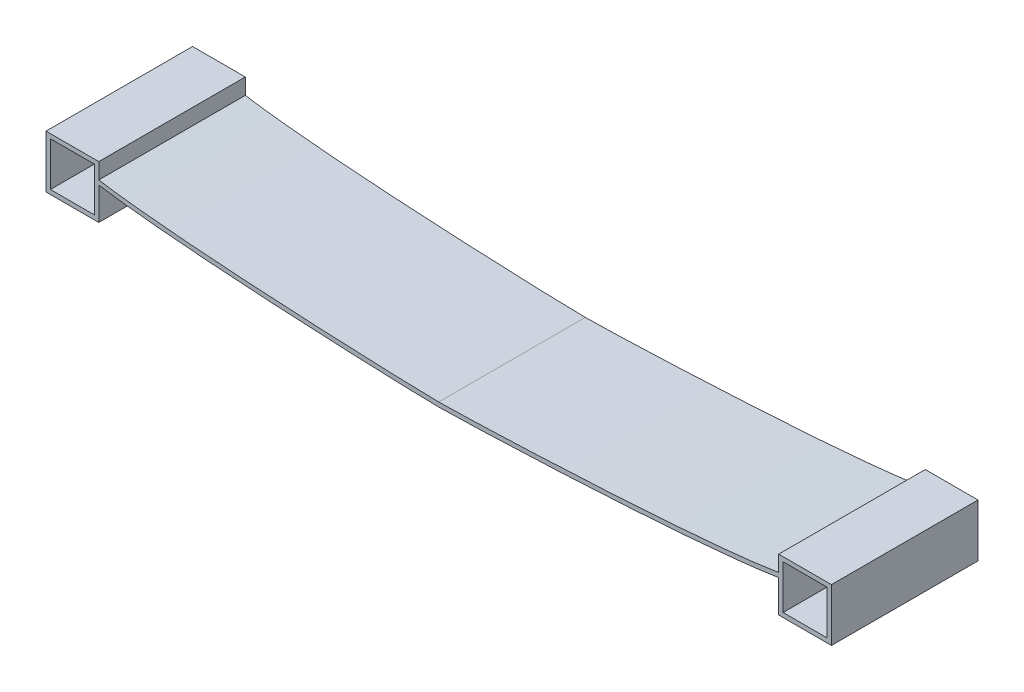
ISO-10303-21;
HEADER;
FILE_DESCRIPTION(('STEP AP214'),'2;1');
FILE_NAME('part.step','',(''),(''),'','','');
FILE_SCHEMA(('AUTOMOTIVE_DESIGN { 1 0 10303 214 1 1 1 1 }'));
ENDSEC;
DATA;
#1=APPLICATION_CONTEXT('core data for automotive mechanical design processes');
#2=APPLICATION_PROTOCOL_DEFINITION('international standard','automotive_design',2000,#1);
#3=PRODUCT_CONTEXT('',#1,'mechanical');
#4=PRODUCT('Part','Part','',(#3));
#5=PRODUCT_RELATED_PRODUCT_CATEGORY('part','',(#4));
#6=PRODUCT_DEFINITION_FORMATION('','',#4);
#7=PRODUCT_DEFINITION_CONTEXT('part definition',#1,'design');
#8=PRODUCT_DEFINITION('design','',#6,#7);
#9=PRODUCT_DEFINITION_SHAPE('','',#8);
#10=(LENGTH_UNIT() NAMED_UNIT(*) SI_UNIT(.MILLI.,.METRE.));
#11=(NAMED_UNIT(*) PLANE_ANGLE_UNIT() SI_UNIT($,.RADIAN.));
#12=(NAMED_UNIT(*) SI_UNIT($,.STERADIAN.) SOLID_ANGLE_UNIT());
#13=UNCERTAINTY_MEASURE_WITH_UNIT(LENGTH_MEASURE(1.E-05),#10,'distance_accuracy_value','');
#14=(GEOMETRIC_REPRESENTATION_CONTEXT(3) GLOBAL_UNCERTAINTY_ASSIGNED_CONTEXT((#13)) GLOBAL_UNIT_ASSIGNED_CONTEXT((#10,
#11,#12)) REPRESENTATION_CONTEXT('',''));
#15=CARTESIAN_POINT('',(0.,0.,0.));
#16=DIRECTION('',(0.,0.,1.));
#17=DIRECTION('',(1.,0.,0.));
#18=AXIS2_PLACEMENT_3D('',#15,#16,#17);
#19=CARTESIAN_POINT('',(-13.1212411793442,121.660948954661,100.));
#20=DIRECTION('',(0.,0.,-1.));
#21=DIRECTION('',(-1.,0.,0.));
#22=AXIS2_PLACEMENT_3D('',#19,#20,#21);
#23=PLANE('',#22);
#24=DIRECTION('',(0.,-1.,0.));
#25=VECTOR('',#24,1.);
#26=CARTESIAN_POINT('',(-177.18258540236,143.814974877647,100.));
#27=LINE('',#26,#25);
#28=CARTESIAN_POINT('',(-177.18258540236,143.814974877647,100.));
#29=VERTEX_POINT('',#28);
#30=CARTESIAN_POINT('',(-177.18258540236,113.814974877647,100.));
#31=VERTEX_POINT('',#30);
#32=EDGE_CURVE('E221',#29,#31,#27,.T.);
#33=ORIENTED_EDGE('',*,*,#32,.F.);
#34=DIRECTION('',(-1.,0.,0.));
#35=VECTOR('',#34,1.);
#36=CARTESIAN_POINT('',(-177.18258540236,143.814974877647,100.));
#37=LINE('',#36,#35);
#38=CARTESIAN_POINT('',(-147.18258540236,143.814974877647,100.));
#39=VERTEX_POINT('',#38);
#40=EDGE_CURVE('E229',#39,#29,#37,.T.);
#41=ORIENTED_EDGE('',*,*,#40,.F.);
#42=DIRECTION('',(0.,1.,0.));
#43=VECTOR('',#42,1.);
#44=CARTESIAN_POINT('',(-147.18258540236,143.814974877647,100.));
#45=LINE('',#44,#43);
#46=CARTESIAN_POINT('',(-147.18258540236,113.814974877647,100.));
#47=VERTEX_POINT('',#46);
#48=EDGE_CURVE('E226',#47,#39,#45,.T.);
#49=ORIENTED_EDGE('',*,*,#48,.F.);
#50=DIRECTION('',(1.,0.,0.));
#51=VECTOR('',#50,1.);
#52=CARTESIAN_POINT('',(-177.18258540236,113.814974877647,100.));
#53=LINE('',#52,#51);
#54=EDGE_CURVE('E223',#31,#47,#53,.T.);
#55=ORIENTED_EDGE('',*,*,#54,.F.);
#56=EDGE_LOOP('',(#33,#41,#49,#55));
#57=FACE_BOUND('',#56,.T.);
#58=CARTESIAN_POINT('',(-144.18258540236,132.93908008279,100.));
#59=CARTESIAN_POINT('',(-83.3546732241608,123.151302776884,100.));
#60=CARTESIAN_POINT('',(67.15308701415,117.723650805961,100.));
#61=CARTESIAN_POINT('',(87.8174145976396,117.723650805961,100.));
#62=B_SPLINE_CURVE_WITH_KNOTS('',3,(#58,#59,#60,#61),.UNSPECIFIED.,.F.,.F.,(4,4),(0.,1.),.UNSPECIFIED.);
#63=CARTESIAN_POINT('',(-144.18258540236,132.93908008279,100.));
#64=VERTEX_POINT('',#63);
#65=CARTESIAN_POINT('',(87.8174145976396,117.723650805961,100.));
#66=VERTEX_POINT('',#65);
#67=EDGE_CURVE('E251',#64,#66,#62,.T.);
#68=ORIENTED_EDGE('',*,*,#67,.T.);
#69=CARTESIAN_POINT('',(87.8174145976396,117.723650805961,100.));
#70=CARTESIAN_POINT('',(108.481742181129,117.723650805961,100.));
#71=CARTESIAN_POINT('',(258.98950241944,123.151302776884,100.));
#72=CARTESIAN_POINT('',(319.81741459764,132.93908008279,100.));
#73=B_SPLINE_CURVE_WITH_KNOTS('',3,(#69,#70,#71,#72),.UNSPECIFIED.,.F.,.F.,(4,4),(0.,1.),.UNSPECIFIED.);
#74=CARTESIAN_POINT('',(319.81741459764,132.93908008279,100.));
#75=VERTEX_POINT('',#74);
#76=EDGE_CURVE('E257',#66,#75,#73,.T.);
#77=ORIENTED_EDGE('',*,*,#76,.T.);
#78=DIRECTION('',(0.,-1.,0.));
#79=VECTOR('',#78,1.);
#80=CARTESIAN_POINT('',(319.81741459764,132.93908008279,100.));
#81=LINE('',#80,#79);
#82=CARTESIAN_POINT('',(319.81741459764,110.814974877647,100.));
#83=VERTEX_POINT('',#82);
#84=EDGE_CURVE('E266',#75,#83,#81,.T.);
#85=ORIENTED_EDGE('',*,*,#84,.T.);
#86=DIRECTION('',(1.,0.,0.));
#87=VECTOR('',#86,1.);
#88=CARTESIAN_POINT('',(319.81741459764,110.814974877647,100.));
#89=LINE('',#88,#87);
#90=CARTESIAN_POINT('',(355.81741459764,110.814974877647,100.));
#91=VERTEX_POINT('',#90);
#92=EDGE_CURVE('E433',#83,#91,#89,.T.);
#93=ORIENTED_EDGE('',*,*,#92,.T.);
#94=DIRECTION('',(0.,1.,0.));
#95=VECTOR('',#94,1.);
#96=CARTESIAN_POINT('',(355.81741459764,146.814974877647,100.));
#97=LINE('',#96,#95);
#98=CARTESIAN_POINT('',(355.81741459764,146.814974877647,100.));
#99=VERTEX_POINT('',#98);
#100=EDGE_CURVE('E429',#91,#99,#97,.T.);
#101=ORIENTED_EDGE('',*,*,#100,.T.);
#102=DIRECTION('',(-1.,0.,0.));
#103=VECTOR('',#102,1.);
#104=CARTESIAN_POINT('',(319.81741459764,146.814974877647,100.));
#105=LINE('',#104,#103);
#106=CARTESIAN_POINT('',(319.81741459764,146.814974877647,100.));
#107=VERTEX_POINT('',#106);
#108=EDGE_CURVE('E432',#99,#107,#105,.T.);
#109=ORIENTED_EDGE('',*,*,#108,.T.);
#110=DIRECTION('',(0.,-1.,0.));
#111=VECTOR('',#110,1.);
#112=CARTESIAN_POINT('',(319.81741459764,146.814974877647,100.));
#113=LINE('',#112,#111);
#114=CARTESIAN_POINT('',(319.81741459764,135.933272710054,100.));
#115=VERTEX_POINT('',#114);
#116=EDGE_CURVE('E309',#107,#115,#113,.T.);
#117=ORIENTED_EDGE('',*,*,#116,.T.);
#118=CARTESIAN_POINT('',(319.81741459764,135.933272710054,100.));
#119=CARTESIAN_POINT('',(259.641023551651,126.149155877593,100.));
#120=CARTESIAN_POINT('',(108.109781754888,120.723650805961,100.));
#121=CARTESIAN_POINT('',(87.8174145976396,120.723650805961,100.));
#122=B_SPLINE_CURVE_WITH_KNOTS('',3,(#118,#119,#120,#121),.UNSPECIFIED.,.F.,.F.,(4,4),(0.,1.),.UNSPECIFIED.);
#123=CARTESIAN_POINT('',(87.8174145976396,120.723650805961,100.));
#124=VERTEX_POINT('',#123);
#125=EDGE_CURVE('E303',#115,#124,#122,.T.);
#126=ORIENTED_EDGE('',*,*,#125,.T.);
#127=CARTESIAN_POINT('',(87.8174145976396,120.723650805961,100.));
#128=CARTESIAN_POINT('',(67.5250474403907,120.723650805961,100.));
#129=CARTESIAN_POINT('',(-84.0061943563722,126.149155877593,100.));
#130=CARTESIAN_POINT('',(-144.18258540236,135.933272710054,100.));
#131=B_SPLINE_CURVE_WITH_KNOTS('',3,(#127,#128,#129,#130),.UNSPECIFIED.,.F.,.F.,(4,4),(0.,1.),.UNSPECIFIED.);
#132=CARTESIAN_POINT('',(-144.18258540236,135.933272710054,100.));
#133=VERTEX_POINT('',#132);
#134=EDGE_CURVE('E308',#124,#133,#131,.T.);
#135=ORIENTED_EDGE('',*,*,#134,.T.);
#136=DIRECTION('',(0.,1.,0.));
#137=VECTOR('',#136,1.);
#138=CARTESIAN_POINT('',(-144.18258540236,146.814974877647,100.));
#139=LINE('',#138,#137);
#140=CARTESIAN_POINT('',(-144.18258540236,146.814974877647,100.));
#141=VERTEX_POINT('',#140);
#142=EDGE_CURVE('E318',#133,#141,#139,.T.);
#143=ORIENTED_EDGE('',*,*,#142,.T.);
#144=DIRECTION('',(-1.,0.,0.));
#145=VECTOR('',#144,1.);
#146=CARTESIAN_POINT('',(-180.18258540236,146.814974877647,100.));
#147=LINE('',#146,#145);
#148=CARTESIAN_POINT('',(-180.18258540236,146.814974877647,100.));
#149=VERTEX_POINT('',#148);
#150=EDGE_CURVE('E323',#141,#149,#147,.T.);
#151=ORIENTED_EDGE('',*,*,#150,.T.);
#152=DIRECTION('',(0.,-1.,0.));
#153=VECTOR('',#152,1.);
#154=CARTESIAN_POINT('',(-180.18258540236,146.814974877647,100.));
#155=LINE('',#154,#153);
#156=CARTESIAN_POINT('',(-180.18258540236,110.814974877647,100.));
#157=VERTEX_POINT('',#156);
#158=EDGE_CURVE('E325',#149,#157,#155,.T.);
#159=ORIENTED_EDGE('',*,*,#158,.T.);
#160=DIRECTION('',(1.,0.,0.));
#161=VECTOR('',#160,1.);
#162=CARTESIAN_POINT('',(-180.18258540236,110.814974877647,100.));
#163=LINE('',#162,#161);
#164=CARTESIAN_POINT('',(-144.18258540236,110.814974877647,100.));
#165=VERTEX_POINT('',#164);
#166=EDGE_CURVE('E327',#157,#165,#163,.T.);
#167=ORIENTED_EDGE('',*,*,#166,.T.);
#168=DIRECTION('',(0.,1.,0.));
#169=VECTOR('',#168,1.);
#170=CARTESIAN_POINT('',(-144.18258540236,132.93908008279,100.));
#171=LINE('',#170,#169);
#172=EDGE_CURVE('E329',#165,#64,#171,.T.);
#173=ORIENTED_EDGE('',*,*,#172,.T.);
#174=EDGE_LOOP('',(#68,#77,#85,#93,#101,#109,#117,#126,#135,#143,#151,#159,#167,#173));
#175=FACE_BOUND('',#174,.T.);
#176=DIRECTION('',(0.,-1.,0.));
#177=VECTOR('',#176,1.);
#178=CARTESIAN_POINT('',(322.81741459764,143.814974877647,100.));
#179=LINE('',#178,#177);
#180=CARTESIAN_POINT('',(322.81741459764,143.814974877647,100.));
#181=VERTEX_POINT('',#180);
#182=CARTESIAN_POINT('',(322.81741459764,113.814974877647,100.));
#183=VERTEX_POINT('',#182);
#184=EDGE_CURVE('E185',#181,#183,#179,.T.);
#185=ORIENTED_EDGE('',*,*,#184,.F.);
#186=DIRECTION('',(-1.,0.,0.));
#187=VECTOR('',#186,1.);
#188=CARTESIAN_POINT('',(322.81741459764,143.814974877647,100.));
#189=LINE('',#188,#187);
#190=CARTESIAN_POINT('',(352.81741459764,143.814974877647,100.));
#191=VERTEX_POINT('',#190);
#192=EDGE_CURVE('E207',#191,#181,#189,.T.);
#193=ORIENTED_EDGE('',*,*,#192,.F.);
#194=DIRECTION('',(0.,1.,0.));
#195=VECTOR('',#194,1.);
#196=CARTESIAN_POINT('',(352.81741459764,143.814974877647,100.));
#197=LINE('',#196,#195);
#198=CARTESIAN_POINT('',(352.81741459764,113.814974877647,100.));
#199=VERTEX_POINT('',#198);
#200=EDGE_CURVE('E205',#199,#191,#197,.T.);
#201=ORIENTED_EDGE('',*,*,#200,.F.);
#202=DIRECTION('',(1.,0.,0.));
#203=VECTOR('',#202,1.);
#204=CARTESIAN_POINT('',(322.81741459764,113.814974877647,100.));
#205=LINE('',#204,#203);
#206=EDGE_CURVE('E193',#183,#199,#205,.T.);
#207=ORIENTED_EDGE('',*,*,#206,.F.);
#208=EDGE_LOOP('',(#185,#193,#201,#207));
#209=FACE_BOUND('',#208,.T.);
#210=ADVANCED_FACE('F35',(#57,#175,#209),#23,.F.);
#211=CARTESIAN_POINT('',(-13.1212411793442,121.660948954661,0.));
#212=DIRECTION('',(0.,0.,-1.));
#213=DIRECTION('',(-1.,0.,0.));
#214=AXIS2_PLACEMENT_3D('',#211,#212,#213);
#215=PLANE('',#214);
#216=CARTESIAN_POINT('',(-144.18258540236,132.93908008279,0.));
#217=CARTESIAN_POINT('',(-83.3546732241608,123.151302776884,0.));
#218=CARTESIAN_POINT('',(67.15308701415,117.723650805961,0.));
#219=CARTESIAN_POINT('',(87.8174145976396,117.723650805961,0.));
#220=B_SPLINE_CURVE_WITH_KNOTS('',3,(#216,#217,#218,#219),.UNSPECIFIED.,.F.,.F.,(4,4),(0.,1.),.UNSPECIFIED.);
#221=CARTESIAN_POINT('',(-144.18258540236,132.93908008279,0.));
#222=VERTEX_POINT('',#221);
#223=CARTESIAN_POINT('',(87.8174145976396,117.723650805961,0.));
#224=VERTEX_POINT('',#223);
#225=EDGE_CURVE('E250',#222,#224,#220,.T.);
#226=ORIENTED_EDGE('',*,*,#225,.F.);
#227=DIRECTION('',(0.,1.,0.));
#228=VECTOR('',#227,1.);
#229=CARTESIAN_POINT('',(-144.18258540236,132.93908008279,0.));
#230=LINE('',#229,#228);
#231=CARTESIAN_POINT('',(-144.18258540236,110.814974877647,0.));
#232=VERTEX_POINT('',#231);
#233=EDGE_CURVE('E258',#232,#222,#230,.T.);
#234=ORIENTED_EDGE('',*,*,#233,.F.);
#235=DIRECTION('',(1.,0.,0.));
#236=VECTOR('',#235,1.);
#237=CARTESIAN_POINT('',(-180.18258540236,110.814974877647,0.));
#238=LINE('',#237,#236);
#239=CARTESIAN_POINT('',(-180.18258540236,110.814974877647,0.));
#240=VERTEX_POINT('',#239);
#241=EDGE_CURVE('E376',#240,#232,#238,.T.);
#242=ORIENTED_EDGE('',*,*,#241,.F.);
#243=DIRECTION('',(0.,-1.,0.));
#244=VECTOR('',#243,1.);
#245=CARTESIAN_POINT('',(-180.18258540236,146.814974877647,0.));
#246=LINE('',#245,#244);
#247=CARTESIAN_POINT('',(-180.18258540236,146.814974877647,0.));
#248=VERTEX_POINT('',#247);
#249=EDGE_CURVE('E374',#248,#240,#246,.T.);
#250=ORIENTED_EDGE('',*,*,#249,.F.);
#251=DIRECTION('',(-1.,0.,0.));
#252=VECTOR('',#251,1.);
#253=CARTESIAN_POINT('',(-180.18258540236,146.814974877647,0.));
#254=LINE('',#253,#252);
#255=CARTESIAN_POINT('',(-144.18258540236,146.814974877647,0.));
#256=VERTEX_POINT('',#255);
#257=EDGE_CURVE('E372',#256,#248,#254,.T.);
#258=ORIENTED_EDGE('',*,*,#257,.F.);
#259=DIRECTION('',(0.,1.,0.));
#260=VECTOR('',#259,1.);
#261=CARTESIAN_POINT('',(-144.18258540236,146.814974877647,0.));
#262=LINE('',#261,#260);
#263=CARTESIAN_POINT('',(-144.18258540236,135.933272710054,0.));
#264=VERTEX_POINT('',#263);
#265=EDGE_CURVE('E367',#264,#256,#262,.T.);
#266=ORIENTED_EDGE('',*,*,#265,.F.);
#267=CARTESIAN_POINT('',(87.8174145976396,120.723650805961,0.));
#268=CARTESIAN_POINT('',(67.5250474403907,120.723650805961,0.));
#269=CARTESIAN_POINT('',(-84.0061943563722,126.149155877593,0.));
#270=CARTESIAN_POINT('',(-144.18258540236,135.933272710054,0.));
#271=B_SPLINE_CURVE_WITH_KNOTS('',3,(#267,#268,#269,#270),.UNSPECIFIED.,.F.,.F.,(4,4),(0.,1.),.UNSPECIFIED.);
#272=CARTESIAN_POINT('',(87.8174145976396,120.723650805961,0.));
#273=VERTEX_POINT('',#272);
#274=EDGE_CURVE('E360',#273,#264,#271,.T.);
#275=ORIENTED_EDGE('',*,*,#274,.F.);
#276=CARTESIAN_POINT('',(319.81741459764,135.933272710054,0.));
#277=CARTESIAN_POINT('',(259.641023551651,126.149155877593,0.));
#278=CARTESIAN_POINT('',(108.109781754888,120.723650805961,0.));
#279=CARTESIAN_POINT('',(87.8174145976396,120.723650805961,0.));
#280=B_SPLINE_CURVE_WITH_KNOTS('',3,(#276,#277,#278,#279),.UNSPECIFIED.,.F.,.F.,(4,4),(0.,1.),.UNSPECIFIED.);
#281=CARTESIAN_POINT('',(319.81741459764,135.933272710054,0.));
#282=VERTEX_POINT('',#281);
#283=EDGE_CURVE('E356',#282,#273,#280,.T.);
#284=ORIENTED_EDGE('',*,*,#283,.F.);
#285=DIRECTION('',(0.,-1.,0.));
#286=VECTOR('',#285,1.);
#287=CARTESIAN_POINT('',(319.81741459764,146.814974877647,0.));
#288=LINE('',#287,#286);
#289=CARTESIAN_POINT('',(319.81741459764,146.814974877647,0.));
#290=VERTEX_POINT('',#289);
#291=EDGE_CURVE('E354',#290,#282,#288,.T.);
#292=ORIENTED_EDGE('',*,*,#291,.F.);
#293=DIRECTION('',(-1.,0.,0.));
#294=VECTOR('',#293,1.);
#295=CARTESIAN_POINT('',(319.81741459764,146.814974877647,0.));
#296=LINE('',#295,#294);
#297=CARTESIAN_POINT('',(355.81741459764,146.814974877647,0.));
#298=VERTEX_POINT('',#297);
#299=EDGE_CURVE('E352',#298,#290,#296,.T.);
#300=ORIENTED_EDGE('',*,*,#299,.F.);
#301=DIRECTION('',(0.,1.,0.));
#302=VECTOR('',#301,1.);
#303=CARTESIAN_POINT('',(355.81741459764,146.814974877647,0.));
#304=LINE('',#303,#302);
#305=CARTESIAN_POINT('',(355.81741459764,110.814974877647,0.));
#306=VERTEX_POINT('',#305);
#307=EDGE_CURVE('E350',#306,#298,#304,.T.);
#308=ORIENTED_EDGE('',*,*,#307,.F.);
#309=DIRECTION('',(1.,0.,0.));
#310=VECTOR('',#309,1.);
#311=CARTESIAN_POINT('',(319.81741459764,110.814974877647,0.));
#312=LINE('',#311,#310);
#313=CARTESIAN_POINT('',(319.81741459764,110.814974877647,0.));
#314=VERTEX_POINT('',#313);
#315=EDGE_CURVE('E348',#314,#306,#312,.T.);
#316=ORIENTED_EDGE('',*,*,#315,.F.);
#317=DIRECTION('',(0.,-1.,0.));
#318=VECTOR('',#317,1.);
#319=CARTESIAN_POINT('',(319.81741459764,132.93908008279,0.));
#320=LINE('',#319,#318);
#321=CARTESIAN_POINT('',(319.81741459764,132.93908008279,0.));
#322=VERTEX_POINT('',#321);
#323=EDGE_CURVE('E343',#322,#314,#320,.T.);
#324=ORIENTED_EDGE('',*,*,#323,.F.);
#325=CARTESIAN_POINT('',(87.8174145976396,117.723650805961,0.));
#326=CARTESIAN_POINT('',(108.481742181129,117.723650805961,0.));
#327=CARTESIAN_POINT('',(258.98950241944,123.151302776884,0.));
#328=CARTESIAN_POINT('',(319.81741459764,132.93908008279,0.));
#329=B_SPLINE_CURVE_WITH_KNOTS('',3,(#325,#326,#327,#328),.UNSPECIFIED.,.F.,.F.,(4,4),(0.,1.),.UNSPECIFIED.);
#330=EDGE_CURVE('E336',#224,#322,#329,.T.);
#331=ORIENTED_EDGE('',*,*,#330,.F.);
#332=EDGE_LOOP('',(#226,#234,#242,#250,#258,#266,#275,#284,#292,#300,#308,#316,#324,#331));
#333=FACE_BOUND('',#332,.T.);
#334=DIRECTION('',(-1.,0.,0.));
#335=VECTOR('',#334,1.);
#336=CARTESIAN_POINT('',(-177.18258540236,143.814974877647,0.));
#337=LINE('',#336,#335);
#338=CARTESIAN_POINT('',(-147.18258540236,143.814974877647,0.));
#339=VERTEX_POINT('',#338);
#340=CARTESIAN_POINT('',(-177.18258540236,143.814974877647,0.));
#341=VERTEX_POINT('',#340);
#342=EDGE_CURVE('E224',#339,#341,#337,.T.);
#343=ORIENTED_EDGE('',*,*,#342,.T.);
#344=DIRECTION('',(0.,-1.,0.));
#345=VECTOR('',#344,1.);
#346=CARTESIAN_POINT('',(-177.18258540236,143.814974877647,0.));
#347=LINE('',#346,#345);
#348=CARTESIAN_POINT('',(-177.18258540236,113.814974877647,0.));
#349=VERTEX_POINT('',#348);
#350=EDGE_CURVE('E201',#341,#349,#347,.T.);
#351=ORIENTED_EDGE('',*,*,#350,.T.);
#352=DIRECTION('',(1.,0.,0.));
#353=VECTOR('',#352,1.);
#354=CARTESIAN_POINT('',(-177.18258540236,113.814974877647,0.));
#355=LINE('',#354,#353);
#356=CARTESIAN_POINT('',(-147.18258540236,113.814974877647,0.));
#357=VERTEX_POINT('',#356);
#358=EDGE_CURVE('E234',#349,#357,#355,.T.);
#359=ORIENTED_EDGE('',*,*,#358,.T.);
#360=DIRECTION('',(0.,1.,0.));
#361=VECTOR('',#360,1.);
#362=CARTESIAN_POINT('',(-147.18258540236,143.814974877647,0.));
#363=LINE('',#362,#361);
#364=EDGE_CURVE('E237',#357,#339,#363,.T.);
#365=ORIENTED_EDGE('',*,*,#364,.T.);
#366=EDGE_LOOP('',(#343,#351,#359,#365));
#367=FACE_BOUND('',#366,.T.);
#368=DIRECTION('',(-1.,0.,0.));
#369=VECTOR('',#368,1.);
#370=CARTESIAN_POINT('',(322.81741459764,143.814974877647,0.));
#371=LINE('',#370,#369);
#372=CARTESIAN_POINT('',(352.81741459764,143.814974877647,0.));
#373=VERTEX_POINT('',#372);
#374=CARTESIAN_POINT('',(322.81741459764,143.814974877647,0.));
#375=VERTEX_POINT('',#374);
#376=EDGE_CURVE('E194',#373,#375,#371,.T.);
#377=ORIENTED_EDGE('',*,*,#376,.T.);
#378=DIRECTION('',(0.,-1.,0.));
#379=VECTOR('',#378,1.);
#380=CARTESIAN_POINT('',(322.81741459764,143.814974877647,0.));
#381=LINE('',#380,#379);
#382=CARTESIAN_POINT('',(322.81741459764,113.814974877647,0.));
#383=VERTEX_POINT('',#382);
#384=EDGE_CURVE('E59',#375,#383,#381,.T.);
#385=ORIENTED_EDGE('',*,*,#384,.T.);
#386=DIRECTION('',(1.,0.,0.));
#387=VECTOR('',#386,1.);
#388=CARTESIAN_POINT('',(322.81741459764,113.814974877647,0.));
#389=LINE('',#388,#387);
#390=CARTESIAN_POINT('',(352.81741459764,113.814974877647,0.));
#391=VERTEX_POINT('',#390);
#392=EDGE_CURVE('E200',#383,#391,#389,.T.);
#393=ORIENTED_EDGE('',*,*,#392,.T.);
#394=DIRECTION('',(0.,1.,0.));
#395=VECTOR('',#394,1.);
#396=CARTESIAN_POINT('',(352.81741459764,143.814974877647,0.));
#397=LINE('',#396,#395);
#398=EDGE_CURVE('E213',#391,#373,#397,.T.);
#399=ORIENTED_EDGE('',*,*,#398,.T.);
#400=EDGE_LOOP('',(#377,#385,#393,#399));
#401=FACE_BOUND('',#400,.T.);
#402=ADVANCED_FACE('F421',(#333,#367,#401),#215,.T.);
#403=DIRECTION('',(0.,0.,-1.));
#404=VECTOR('',#403,1.);
#405=SURFACE_OF_LINEAR_EXTRUSION('',#62,#404);
#406=ORIENTED_EDGE('',*,*,#225,.T.);
#407=DIRECTION('',(0.,0.,-1.));
#408=VECTOR('',#407,1.);
#409=CARTESIAN_POINT('',(87.8174145976396,117.723650805961,100.));
#410=LINE('',#409,#408);
#411=EDGE_CURVE('E11',#66,#224,#410,.T.);
#412=ORIENTED_EDGE('',*,*,#411,.F.);
#413=ORIENTED_EDGE('',*,*,#67,.F.);
#414=DIRECTION('',(0.,0.,-1.));
#415=VECTOR('',#414,1.);
#416=CARTESIAN_POINT('',(-144.18258540236,132.93908008279,100.));
#417=LINE('',#416,#415);
#418=EDGE_CURVE('E331',#64,#222,#417,.T.);
#419=ORIENTED_EDGE('',*,*,#418,.T.);
#420=EDGE_LOOP('',(#406,#412,#413,#419));
#421=FACE_BOUND('',#420,.T.);
#422=ADVANCED_FACE('F37',(#421),#405,.F.);
#423=DIRECTION('',(0.,0.,-1.));
#424=VECTOR('',#423,1.);
#425=SURFACE_OF_LINEAR_EXTRUSION('',#73,#424);
#426=ORIENTED_EDGE('',*,*,#330,.T.);
#427=DIRECTION('',(0.,0.,-1.));
#428=VECTOR('',#427,1.);
#429=CARTESIAN_POINT('',(319.81741459764,132.93908008279,100.));
#430=LINE('',#429,#428);
#431=EDGE_CURVE('E44',#75,#322,#430,.T.);
#432=ORIENTED_EDGE('',*,*,#431,.F.);
#433=ORIENTED_EDGE('',*,*,#76,.F.);
#434=ORIENTED_EDGE('',*,*,#411,.T.);
#435=EDGE_LOOP('',(#426,#432,#433,#434));
#436=FACE_BOUND('',#435,.T.);
#437=ADVANCED_FACE('F271',(#436),#425,.F.);
#438=CARTESIAN_POINT('',(319.81741459764,132.93908008279,100.));
#439=DIRECTION('',(1.,0.,0.));
#440=DIRECTION('',(0.,0.,-1.));
#441=AXIS2_PLACEMENT_3D('',#438,#439,#440);
#442=PLANE('',#441);
#443=ORIENTED_EDGE('',*,*,#323,.T.);
#444=DIRECTION('',(0.,0.,-1.));
#445=VECTOR('',#444,1.);
#446=CARTESIAN_POINT('',(319.81741459764,110.814974877647,100.));
#447=LINE('',#446,#445);
#448=EDGE_CURVE('E411',#83,#314,#447,.T.);
#449=ORIENTED_EDGE('',*,*,#448,.F.);
#450=ORIENTED_EDGE('',*,*,#84,.F.);
#451=ORIENTED_EDGE('',*,*,#431,.T.);
#452=EDGE_LOOP('',(#443,#449,#450,#451));
#453=FACE_BOUND('',#452,.T.);
#454=ADVANCED_FACE('F274',(#453),#442,.F.);
#455=CARTESIAN_POINT('',(319.81741459764,110.814974877647,100.));
#456=DIRECTION('',(0.,1.,0.));
#457=DIRECTION('',(0.,0.,1.));
#458=AXIS2_PLACEMENT_3D('',#455,#456,#457);
#459=PLANE('',#458);
#460=ORIENTED_EDGE('',*,*,#315,.T.);
#461=DIRECTION('',(0.,0.,-1.));
#462=VECTOR('',#461,1.);
#463=CARTESIAN_POINT('',(355.81741459764,110.814974877647,100.));
#464=LINE('',#463,#462);
#465=EDGE_CURVE('E408',#91,#306,#464,.T.);
#466=ORIENTED_EDGE('',*,*,#465,.F.);
#467=ORIENTED_EDGE('',*,*,#92,.F.);
#468=ORIENTED_EDGE('',*,*,#448,.T.);
#469=EDGE_LOOP('',(#460,#466,#467,#468));
#470=FACE_BOUND('',#469,.T.);
#471=ADVANCED_FACE('F278',(#470),#459,.F.);
#472=CARTESIAN_POINT('',(355.81741459764,146.814974877647,100.));
#473=DIRECTION('',(-1.,0.,0.));
#474=DIRECTION('',(0.,0.,1.));
#475=AXIS2_PLACEMENT_3D('',#472,#473,#474);
#476=PLANE('',#475);
#477=ORIENTED_EDGE('',*,*,#307,.T.);
#478=DIRECTION('',(0.,0.,-1.));
#479=VECTOR('',#478,1.);
#480=CARTESIAN_POINT('',(355.81741459764,146.814974877647,100.));
#481=LINE('',#480,#479);
#482=EDGE_CURVE('E405',#99,#298,#481,.T.);
#483=ORIENTED_EDGE('',*,*,#482,.F.);
#484=ORIENTED_EDGE('',*,*,#100,.F.);
#485=ORIENTED_EDGE('',*,*,#465,.T.);
#486=EDGE_LOOP('',(#477,#483,#484,#485));
#487=FACE_BOUND('',#486,.T.);
#488=ADVANCED_FACE('F282',(#487),#476,.F.);
#489=CARTESIAN_POINT('',(319.81741459764,146.814974877647,100.));
#490=DIRECTION('',(0.,-1.,0.));
#491=DIRECTION('',(0.,0.,-1.));
#492=AXIS2_PLACEMENT_3D('',#489,#490,#491);
#493=PLANE('',#492);
#494=ORIENTED_EDGE('',*,*,#299,.T.);
#495=DIRECTION('',(0.,0.,-1.));
#496=VECTOR('',#495,1.);
#497=CARTESIAN_POINT('',(319.81741459764,146.814974877647,100.));
#498=LINE('',#497,#496);
#499=EDGE_CURVE('E402',#107,#290,#498,.T.);
#500=ORIENTED_EDGE('',*,*,#499,.F.);
#501=ORIENTED_EDGE('',*,*,#108,.F.);
#502=ORIENTED_EDGE('',*,*,#482,.T.);
#503=EDGE_LOOP('',(#494,#500,#501,#502));
#504=FACE_BOUND('',#503,.T.);
#505=ADVANCED_FACE('F286',(#504),#493,.F.);
#506=CARTESIAN_POINT('',(319.81741459764,146.814974877647,100.));
#507=DIRECTION('',(1.,0.,0.));
#508=DIRECTION('',(0.,0.,-1.));
#509=AXIS2_PLACEMENT_3D('',#506,#507,#508);
#510=PLANE('',#509);
#511=ORIENTED_EDGE('',*,*,#291,.T.);
#512=DIRECTION('',(0.,0.,-1.));
#513=VECTOR('',#512,1.);
#514=CARTESIAN_POINT('',(319.81741459764,135.933272710054,100.));
#515=LINE('',#514,#513);
#516=EDGE_CURVE('E399',#115,#282,#515,.T.);
#517=ORIENTED_EDGE('',*,*,#516,.F.);
#518=ORIENTED_EDGE('',*,*,#116,.F.);
#519=ORIENTED_EDGE('',*,*,#499,.T.);
#520=EDGE_LOOP('',(#511,#517,#518,#519));
#521=FACE_BOUND('',#520,.T.);
#522=ADVANCED_FACE('F290',(#521),#510,.F.);
#523=DIRECTION('',(0.,0.,-1.));
#524=VECTOR('',#523,1.);
#525=SURFACE_OF_LINEAR_EXTRUSION('',#122,#524);
#526=ORIENTED_EDGE('',*,*,#283,.T.);
#527=DIRECTION('',(0.,0.,-1.));
#528=VECTOR('',#527,1.);
#529=CARTESIAN_POINT('',(87.8174145976396,120.723650805961,100.));
#530=LINE('',#529,#528);
#531=EDGE_CURVE('E396',#124,#273,#530,.T.);
#532=ORIENTED_EDGE('',*,*,#531,.F.);
#533=ORIENTED_EDGE('',*,*,#125,.F.);
#534=ORIENTED_EDGE('',*,*,#516,.T.);
#535=EDGE_LOOP('',(#526,#532,#533,#534));
#536=FACE_BOUND('',#535,.T.);
#537=ADVANCED_FACE('F294',(#536),#525,.F.);
#538=DIRECTION('',(0.,0.,-1.));
#539=VECTOR('',#538,1.);
#540=SURFACE_OF_LINEAR_EXTRUSION('',#131,#539);
#541=ORIENTED_EDGE('',*,*,#274,.T.);
#542=DIRECTION('',(0.,0.,-1.));
#543=VECTOR('',#542,1.);
#544=CARTESIAN_POINT('',(-144.18258540236,135.933272710054,100.));
#545=LINE('',#544,#543);
#546=EDGE_CURVE('E393',#133,#264,#545,.T.);
#547=ORIENTED_EDGE('',*,*,#546,.F.);
#548=ORIENTED_EDGE('',*,*,#134,.F.);
#549=ORIENTED_EDGE('',*,*,#531,.T.);
#550=EDGE_LOOP('',(#541,#547,#548,#549));
#551=FACE_BOUND('',#550,.T.);
#552=ADVANCED_FACE('F299',(#551),#540,.F.);
#553=CARTESIAN_POINT('',(-144.18258540236,146.814974877647,100.));
#554=DIRECTION('',(-1.,0.,0.));
#555=DIRECTION('',(0.,0.,1.));
#556=AXIS2_PLACEMENT_3D('',#553,#554,#555);
#557=PLANE('',#556);
#558=ORIENTED_EDGE('',*,*,#265,.T.);
#559=DIRECTION('',(0.,0.,-1.));
#560=VECTOR('',#559,1.);
#561=CARTESIAN_POINT('',(-144.18258540236,146.814974877647,100.));
#562=LINE('',#561,#560);
#563=EDGE_CURVE('E390',#141,#256,#562,.T.);
#564=ORIENTED_EDGE('',*,*,#563,.F.);
#565=ORIENTED_EDGE('',*,*,#142,.F.);
#566=ORIENTED_EDGE('',*,*,#546,.T.);
#567=EDGE_LOOP('',(#558,#564,#565,#566));
#568=FACE_BOUND('',#567,.T.);
#569=ADVANCED_FACE('F463',(#568),#557,.F.);
#570=CARTESIAN_POINT('',(-180.18258540236,146.814974877647,100.));
#571=DIRECTION('',(0.,-1.,0.));
#572=DIRECTION('',(0.,0.,-1.));
#573=AXIS2_PLACEMENT_3D('',#570,#571,#572);
#574=PLANE('',#573);
#575=ORIENTED_EDGE('',*,*,#257,.T.);
#576=DIRECTION('',(0.,0.,-1.));
#577=VECTOR('',#576,1.);
#578=CARTESIAN_POINT('',(-180.18258540236,146.814974877647,100.));
#579=LINE('',#578,#577);
#580=EDGE_CURVE('E387',#149,#248,#579,.T.);
#581=ORIENTED_EDGE('',*,*,#580,.F.);
#582=ORIENTED_EDGE('',*,*,#150,.F.);
#583=ORIENTED_EDGE('',*,*,#563,.T.);
#584=EDGE_LOOP('',(#575,#581,#582,#583));
#585=FACE_BOUND('',#584,.T.);
#586=ADVANCED_FACE('F458',(#585),#574,.F.);
#587=CARTESIAN_POINT('',(-180.18258540236,146.814974877647,100.));
#588=DIRECTION('',(1.,0.,0.));
#589=DIRECTION('',(0.,0.,-1.));
#590=AXIS2_PLACEMENT_3D('',#587,#588,#589);
#591=PLANE('',#590);
#592=ORIENTED_EDGE('',*,*,#249,.T.);
#593=DIRECTION('',(0.,0.,-1.));
#594=VECTOR('',#593,1.);
#595=CARTESIAN_POINT('',(-180.18258540236,110.814974877647,100.));
#596=LINE('',#595,#594);
#597=EDGE_CURVE('E384',#157,#240,#596,.T.);
#598=ORIENTED_EDGE('',*,*,#597,.F.);
#599=ORIENTED_EDGE('',*,*,#158,.F.);
#600=ORIENTED_EDGE('',*,*,#580,.T.);
#601=EDGE_LOOP('',(#592,#598,#599,#600));
#602=FACE_BOUND('',#601,.T.);
#603=ADVANCED_FACE('F452',(#602),#591,.F.);
#604=CARTESIAN_POINT('',(-180.18258540236,110.814974877647,100.));
#605=DIRECTION('',(0.,1.,0.));
#606=DIRECTION('',(0.,0.,1.));
#607=AXIS2_PLACEMENT_3D('',#604,#605,#606);
#608=PLANE('',#607);
#609=ORIENTED_EDGE('',*,*,#241,.T.);
#610=DIRECTION('',(0.,0.,-1.));
#611=VECTOR('',#610,1.);
#612=CARTESIAN_POINT('',(-144.18258540236,110.814974877647,100.));
#613=LINE('',#612,#611);
#614=EDGE_CURVE('E381',#165,#232,#613,.T.);
#615=ORIENTED_EDGE('',*,*,#614,.F.);
#616=ORIENTED_EDGE('',*,*,#166,.F.);
#617=ORIENTED_EDGE('',*,*,#597,.T.);
#618=EDGE_LOOP('',(#609,#615,#616,#617));
#619=FACE_BOUND('',#618,.T.);
#620=ADVANCED_FACE('F448',(#619),#608,.F.);
#621=CARTESIAN_POINT('',(-144.18258540236,132.93908008279,100.));
#622=DIRECTION('',(-1.,0.,0.));
#623=DIRECTION('',(0.,0.,1.));
#624=AXIS2_PLACEMENT_3D('',#621,#622,#623);
#625=PLANE('',#624);
#626=ORIENTED_EDGE('',*,*,#233,.T.);
#627=ORIENTED_EDGE('',*,*,#418,.F.);
#628=ORIENTED_EDGE('',*,*,#172,.F.);
#629=ORIENTED_EDGE('',*,*,#614,.T.);
#630=EDGE_LOOP('',(#626,#627,#628,#629));
#631=FACE_BOUND('',#630,.T.);
#632=ADVANCED_FACE('F443',(#631),#625,.F.);
#633=CARTESIAN_POINT('',(-177.18258540236,143.814974877647,100.));
#634=DIRECTION('',(1.,0.,0.));
#635=DIRECTION('',(0.,0.,-1.));
#636=AXIS2_PLACEMENT_3D('',#633,#634,#635);
#637=PLANE('',#636);
#638=ORIENTED_EDGE('',*,*,#350,.F.);
#639=DIRECTION('',(0.,0.,-1.));
#640=VECTOR('',#639,1.);
#641=CARTESIAN_POINT('',(-177.18258540236,143.814974877647,100.));
#642=LINE('',#641,#640);
#643=EDGE_CURVE('E231',#29,#341,#642,.T.);
#644=ORIENTED_EDGE('',*,*,#643,.F.);
#645=ORIENTED_EDGE('',*,*,#32,.T.);
#646=DIRECTION('',(0.,0.,-1.));
#647=VECTOR('',#646,1.);
#648=CARTESIAN_POINT('',(-177.18258540236,113.814974877647,100.));
#649=LINE('',#648,#647);
#650=EDGE_CURVE('E248',#31,#349,#649,.T.);
#651=ORIENTED_EDGE('',*,*,#650,.T.);
#652=EDGE_LOOP('',(#638,#644,#645,#651));
#653=FACE_BOUND('',#652,.T.);
#654=ADVANCED_FACE('F487',(#653),#637,.T.);
#655=CARTESIAN_POINT('',(-177.18258540236,113.814974877647,100.));
#656=DIRECTION('',(0.,1.,0.));
#657=DIRECTION('',(0.,0.,1.));
#658=AXIS2_PLACEMENT_3D('',#655,#656,#657);
#659=PLANE('',#658);
#660=ORIENTED_EDGE('',*,*,#358,.F.);
#661=ORIENTED_EDGE('',*,*,#650,.F.);
#662=ORIENTED_EDGE('',*,*,#54,.T.);
#663=DIRECTION('',(0.,0.,-1.));
#664=VECTOR('',#663,1.);
#665=CARTESIAN_POINT('',(-147.18258540236,113.814974877647,100.));
#666=LINE('',#665,#664);
#667=EDGE_CURVE('E246',#47,#357,#666,.T.);
#668=ORIENTED_EDGE('',*,*,#667,.T.);
#669=EDGE_LOOP('',(#660,#661,#662,#668));
#670=FACE_BOUND('',#669,.T.);
#671=ADVANCED_FACE('F519',(#670),#659,.T.);
#672=CARTESIAN_POINT('',(-147.18258540236,143.814974877647,100.));
#673=DIRECTION('',(-1.,0.,0.));
#674=DIRECTION('',(0.,0.,1.));
#675=AXIS2_PLACEMENT_3D('',#672,#673,#674);
#676=PLANE('',#675);
#677=ORIENTED_EDGE('',*,*,#364,.F.);
#678=ORIENTED_EDGE('',*,*,#667,.F.);
#679=ORIENTED_EDGE('',*,*,#48,.T.);
#680=DIRECTION('',(0.,0.,-1.));
#681=VECTOR('',#680,1.);
#682=CARTESIAN_POINT('',(-147.18258540236,143.814974877647,100.));
#683=LINE('',#682,#681);
#684=EDGE_CURVE('E244',#39,#339,#683,.T.);
#685=ORIENTED_EDGE('',*,*,#684,.T.);
#686=EDGE_LOOP('',(#677,#678,#679,#685));
#687=FACE_BOUND('',#686,.T.);
#688=ADVANCED_FACE('F526',(#687),#676,.T.);
#689=CARTESIAN_POINT('',(-177.18258540236,143.814974877647,100.));
#690=DIRECTION('',(0.,-1.,0.));
#691=DIRECTION('',(0.,0.,-1.));
#692=AXIS2_PLACEMENT_3D('',#689,#690,#691);
#693=PLANE('',#692);
#694=ORIENTED_EDGE('',*,*,#342,.F.);
#695=ORIENTED_EDGE('',*,*,#684,.F.);
#696=ORIENTED_EDGE('',*,*,#40,.T.);
#697=ORIENTED_EDGE('',*,*,#643,.T.);
#698=EDGE_LOOP('',(#694,#695,#696,#697));
#699=FACE_BOUND('',#698,.T.);
#700=ADVANCED_FACE('F533',(#699),#693,.T.);
#701=CARTESIAN_POINT('',(322.81741459764,143.814974877647,100.));
#702=DIRECTION('',(1.,0.,0.));
#703=DIRECTION('',(0.,0.,-1.));
#704=AXIS2_PLACEMENT_3D('',#701,#702,#703);
#705=PLANE('',#704);
#706=ORIENTED_EDGE('',*,*,#384,.F.);
#707=DIRECTION('',(0.,0.,-1.));
#708=VECTOR('',#707,1.);
#709=CARTESIAN_POINT('',(322.81741459764,143.814974877647,100.));
#710=LINE('',#709,#708);
#711=EDGE_CURVE('E189',#181,#375,#710,.T.);
#712=ORIENTED_EDGE('',*,*,#711,.F.);
#713=ORIENTED_EDGE('',*,*,#184,.T.);
#714=DIRECTION('',(0.,0.,-1.));
#715=VECTOR('',#714,1.);
#716=CARTESIAN_POINT('',(322.81741459764,113.814974877647,100.));
#717=LINE('',#716,#715);
#718=EDGE_CURVE('E188',#183,#383,#717,.T.);
#719=ORIENTED_EDGE('',*,*,#718,.T.);
#720=EDGE_LOOP('',(#706,#712,#713,#719));
#721=FACE_BOUND('',#720,.T.);
#722=ADVANCED_FACE('F187',(#721),#705,.T.);
#723=CARTESIAN_POINT('',(322.81741459764,113.814974877647,100.));
#724=DIRECTION('',(0.,1.,0.));
#725=DIRECTION('',(0.,0.,1.));
#726=AXIS2_PLACEMENT_3D('',#723,#724,#725);
#727=PLANE('',#726);
#728=ORIENTED_EDGE('',*,*,#392,.F.);
#729=ORIENTED_EDGE('',*,*,#718,.F.);
#730=ORIENTED_EDGE('',*,*,#206,.T.);
#731=DIRECTION('',(0.,0.,-1.));
#732=VECTOR('',#731,1.);
#733=CARTESIAN_POINT('',(352.81741459764,113.814974877647,100.));
#734=LINE('',#733,#732);
#735=EDGE_CURVE('E202',#199,#391,#734,.T.);
#736=ORIENTED_EDGE('',*,*,#735,.T.);
#737=EDGE_LOOP('',(#728,#729,#730,#736));
#738=FACE_BOUND('',#737,.T.);
#739=ADVANCED_FACE('F197',(#738),#727,.T.);
#740=CARTESIAN_POINT('',(352.81741459764,143.814974877647,100.));
#741=DIRECTION('',(-1.,0.,0.));
#742=DIRECTION('',(0.,0.,1.));
#743=AXIS2_PLACEMENT_3D('',#740,#741,#742);
#744=PLANE('',#743);
#745=ORIENTED_EDGE('',*,*,#398,.F.);
#746=ORIENTED_EDGE('',*,*,#735,.F.);
#747=ORIENTED_EDGE('',*,*,#200,.T.);
#748=DIRECTION('',(0.,0.,-1.));
#749=VECTOR('',#748,1.);
#750=CARTESIAN_POINT('',(352.81741459764,143.814974877647,100.));
#751=LINE('',#750,#749);
#752=EDGE_CURVE('E51',#191,#373,#751,.T.);
#753=ORIENTED_EDGE('',*,*,#752,.T.);
#754=EDGE_LOOP('',(#745,#746,#747,#753));
#755=FACE_BOUND('',#754,.T.);
#756=ADVANCED_FACE('F554',(#755),#744,.T.);
#757=CARTESIAN_POINT('',(322.81741459764,143.814974877647,100.));
#758=DIRECTION('',(0.,-1.,0.));
#759=DIRECTION('',(1.,0.,0.));
#760=AXIS2_PLACEMENT_3D('',#757,#758,#759);
#761=PLANE('',#760);
#762=ORIENTED_EDGE('',*,*,#376,.F.);
#763=ORIENTED_EDGE('',*,*,#752,.F.);
#764=ORIENTED_EDGE('',*,*,#192,.T.);
#765=ORIENTED_EDGE('',*,*,#711,.T.);
#766=EDGE_LOOP('',(#762,#763,#764,#765));
#767=FACE_BOUND('',#766,.T.);
#768=ADVANCED_FACE('F561',(#767),#761,.T.);
#769=CLOSED_SHELL('',(#210,#402,#422,#437,#454,#471,#488,#505,#522,#537,#552,#569,#586,#603,
#620,#632,#654,#671,#688,#700,#722,#739,#756,#768));
#770=MANIFOLD_SOLID_BREP('B2',#769);
#771=ADVANCED_BREP_SHAPE_REPRESENTATION('',(#18,#770),#14);
#772=SHAPE_DEFINITION_REPRESENTATION(#9,#771);
ENDSEC;
END-ISO-10303-21;
